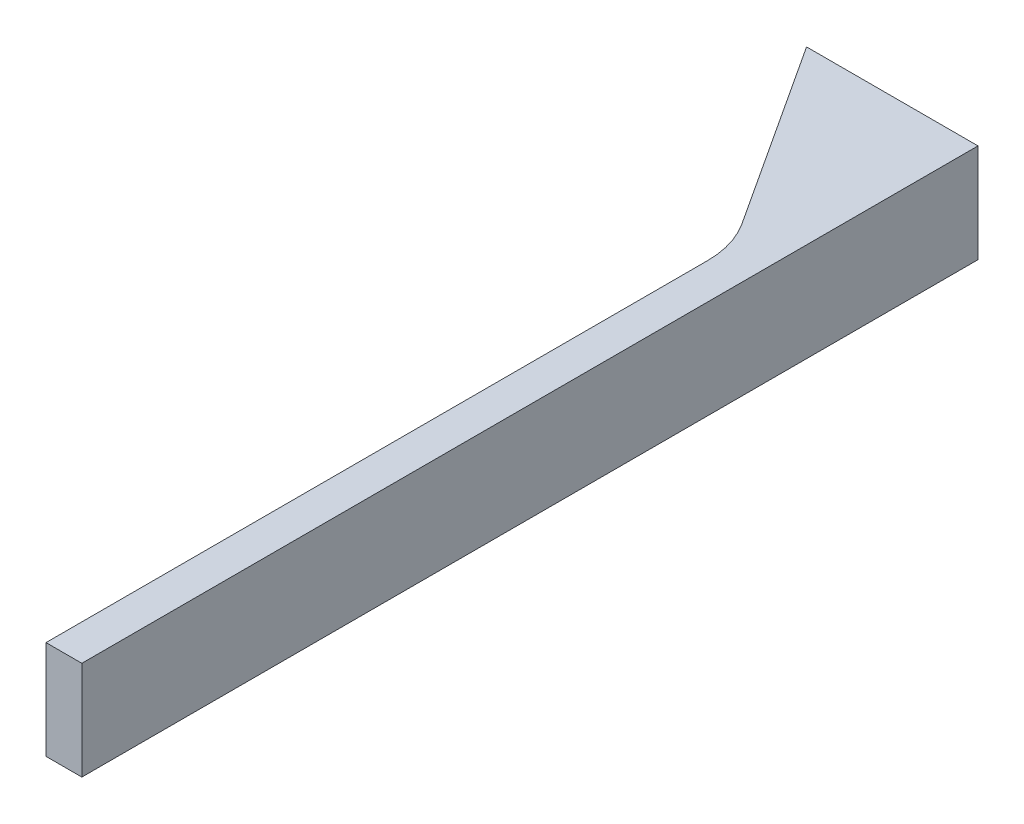
ISO-10303-21;
HEADER;
FILE_DESCRIPTION(('STEP AP214'),'2;1');
FILE_NAME('part.step','',(''),(''),'','','');
FILE_SCHEMA(('AUTOMOTIVE_DESIGN { 1 0 10303 214 1 1 1 1 }'));
ENDSEC;
DATA;
#1=APPLICATION_CONTEXT('core data for automotive mechanical design processes');
#2=APPLICATION_PROTOCOL_DEFINITION('international standard','automotive_design',2000,#1);
#3=PRODUCT_CONTEXT('',#1,'mechanical');
#4=PRODUCT('Part','Part','',(#3));
#5=PRODUCT_RELATED_PRODUCT_CATEGORY('part','',(#4));
#6=PRODUCT_DEFINITION_FORMATION('','',#4);
#7=PRODUCT_DEFINITION_CONTEXT('part definition',#1,'design');
#8=PRODUCT_DEFINITION('design','',#6,#7);
#9=PRODUCT_DEFINITION_SHAPE('','',#8);
#10=(LENGTH_UNIT() NAMED_UNIT(*) SI_UNIT(.MILLI.,.METRE.));
#11=(NAMED_UNIT(*) PLANE_ANGLE_UNIT() SI_UNIT($,.RADIAN.));
#12=(NAMED_UNIT(*) SI_UNIT($,.STERADIAN.) SOLID_ANGLE_UNIT());
#13=UNCERTAINTY_MEASURE_WITH_UNIT(LENGTH_MEASURE(1.E-05),#10,'distance_accuracy_value','');
#14=(GEOMETRIC_REPRESENTATION_CONTEXT(3) GLOBAL_UNCERTAINTY_ASSIGNED_CONTEXT((#13)) GLOBAL_UNIT_ASSIGNED_CONTEXT((#10,
#11,#12)) REPRESENTATION_CONTEXT('',''));
#15=CARTESIAN_POINT('',(0.,0.,0.));
#16=DIRECTION('',(0.,0.,1.));
#17=DIRECTION('',(1.,0.,0.));
#18=AXIS2_PLACEMENT_3D('',#15,#16,#17);
#19=CARTESIAN_POINT('',(-15.,-5.5,-100.));
#20=DIRECTION('',(-1.,0.,0.));
#21=DIRECTION('',(0.,0.,1.));
#22=AXIS2_PLACEMENT_3D('',#19,#20,#21);
#23=PLANE('',#22);
#24=DIRECTION('',(0.,0.,1.));
#25=VECTOR('',#24,1.);
#26=CARTESIAN_POINT('',(-15.,5.5,-100.));
#27=LINE('',#26,#25);
#28=CARTESIAN_POINT('',(-15.,5.5,-73.8116063262557));
#29=VERTEX_POINT('',#28);
#30=CARTESIAN_POINT('',(-15.,5.5,0.));
#31=VERTEX_POINT('',#30);
#32=EDGE_CURVE('E151',#29,#31,#27,.T.);
#33=ORIENTED_EDGE('',*,*,#32,.F.);
#34=DIRECTION('',(0.,-1.,0.));
#35=VECTOR('',#34,1.);
#36=CARTESIAN_POINT('',(-15.,-5.5,-73.8116063262557));
#37=LINE('',#36,#35);
#38=CARTESIAN_POINT('',(-15.,-5.5,-73.8116063262557));
#39=VERTEX_POINT('',#38);
#40=EDGE_CURVE('E147',#29,#39,#37,.T.);
#41=ORIENTED_EDGE('',*,*,#40,.T.);
#42=DIRECTION('',(0.,0.,1.));
#43=VECTOR('',#42,1.);
#44=CARTESIAN_POINT('',(-15.,-5.5,-100.));
#45=LINE('',#44,#43);
#46=CARTESIAN_POINT('',(-15.,-5.5,0.));
#47=VERTEX_POINT('',#46);
#48=EDGE_CURVE('E148',#39,#47,#45,.T.);
#49=ORIENTED_EDGE('',*,*,#48,.T.);
#50=DIRECTION('',(0.,-1.,0.));
#51=VECTOR('',#50,1.);
#52=CARTESIAN_POINT('',(-15.,-5.5,0.));
#53=LINE('',#52,#51);
#54=EDGE_CURVE('E137',#31,#47,#53,.T.);
#55=ORIENTED_EDGE('',*,*,#54,.F.);
#56=EDGE_LOOP('',(#33,#41,#49,#55));
#57=FACE_BOUND('',#56,.T.);
#58=ADVANCED_FACE('F45',(#57),#23,.T.);
#59=CARTESIAN_POINT('',(-11.,5.5,-100.));
#60=DIRECTION('',(1.,0.,0.));
#61=DIRECTION('',(0.,0.,-1.));
#62=AXIS2_PLACEMENT_3D('',#59,#60,#61);
#63=PLANE('',#62);
#64=DIRECTION('',(0.,1.,0.));
#65=VECTOR('',#64,1.);
#66=CARTESIAN_POINT('',(-11.,5.5,0.));
#67=LINE('',#66,#65);
#68=CARTESIAN_POINT('',(-11.,-5.5,0.));
#69=VERTEX_POINT('',#68);
#70=CARTESIAN_POINT('',(-11.,5.5,0.));
#71=VERTEX_POINT('',#70);
#72=EDGE_CURVE('E121',#69,#71,#67,.T.);
#73=ORIENTED_EDGE('',*,*,#72,.F.);
#74=DIRECTION('',(0.,0.,1.));
#75=VECTOR('',#74,1.);
#76=CARTESIAN_POINT('',(-11.,-5.5,-100.));
#77=LINE('',#76,#75);
#78=CARTESIAN_POINT('',(-11.,-5.5,-100.));
#79=VERTEX_POINT('',#78);
#80=EDGE_CURVE('E144',#79,#69,#77,.T.);
#81=ORIENTED_EDGE('',*,*,#80,.F.);
#82=DIRECTION('',(0.,1.,0.));
#83=VECTOR('',#82,1.);
#84=CARTESIAN_POINT('',(-11.,5.5,-100.));
#85=LINE('',#84,#83);
#86=CARTESIAN_POINT('',(-11.,5.5,-100.));
#87=VERTEX_POINT('',#86);
#88=EDGE_CURVE('E115',#79,#87,#85,.T.);
#89=ORIENTED_EDGE('',*,*,#88,.T.);
#90=DIRECTION('',(0.,0.,1.));
#91=VECTOR('',#90,1.);
#92=CARTESIAN_POINT('',(-11.,5.5,-100.));
#93=LINE('',#92,#91);
#94=EDGE_CURVE('E109',#87,#71,#93,.T.);
#95=ORIENTED_EDGE('',*,*,#94,.T.);
#96=EDGE_LOOP('',(#73,#81,#89,#95));
#97=FACE_BOUND('',#96,.T.);
#98=ADVANCED_FACE('F177',(#97),#63,.T.);
#99=CARTESIAN_POINT('',(-11.,-5.5,-100.));
#100=DIRECTION('',(0.,-1.,0.));
#101=DIRECTION('',(0.,0.,-1.));
#102=AXIS2_PLACEMENT_3D('',#99,#100,#101);
#103=PLANE('',#102);
#104=DIRECTION('',(1.,0.,0.));
#105=VECTOR('',#104,1.);
#106=CARTESIAN_POINT('',(-11.,-5.5,0.));
#107=LINE('',#106,#105);
#108=EDGE_CURVE('E130',#47,#69,#107,.T.);
#109=ORIENTED_EDGE('',*,*,#108,.F.);
#110=ORIENTED_EDGE('',*,*,#48,.F.);
#111=CARTESIAN_POINT('',(-25.,-5.5,-73.8116063262557));
#112=DIRECTION('',(0.,-1.,0.));
#113=DIRECTION('',(0.,0.,-1.));
#114=AXIS2_PLACEMENT_3D('',#111,#112,#113);
#115=CIRCLE('',#114,10.);
#116=CARTESIAN_POINT('',(-16.6221021922619,-5.5,-79.2715356594153));
#117=VERTEX_POINT('',#116);
#118=EDGE_CURVE('E54',#39,#117,#115,.F.);
#119=ORIENTED_EDGE('',*,*,#118,.T.);
#120=DIRECTION('',(-0.545992933315959,0.,-0.837789780773814));
#121=VECTOR('',#120,1.);
#122=CARTESIAN_POINT('',(-30.1309743558704,-5.5,-100.));
#123=LINE('',#122,#121);
#124=CARTESIAN_POINT('',(-30.1309743558704,-5.5,-100.));
#125=VERTEX_POINT('',#124);
#126=EDGE_CURVE('E103',#117,#125,#123,.T.);
#127=ORIENTED_EDGE('',*,*,#126,.T.);
#128=DIRECTION('',(1.,0.,0.));
#129=VECTOR('',#128,1.);
#130=CARTESIAN_POINT('',(-11.,-5.5,-100.));
#131=LINE('',#130,#129);
#132=EDGE_CURVE('E114',#125,#79,#131,.T.);
#133=ORIENTED_EDGE('',*,*,#132,.T.);
#134=ORIENTED_EDGE('',*,*,#80,.T.);
#135=EDGE_LOOP('',(#109,#110,#119,#127,#133,#134));
#136=FACE_BOUND('',#135,.T.);
#137=ADVANCED_FACE('F167',(#136),#103,.T.);
#138=CARTESIAN_POINT('',(-15.,5.5,-100.));
#139=DIRECTION('',(0.,1.,0.));
#140=DIRECTION('',(0.,0.,1.));
#141=AXIS2_PLACEMENT_3D('',#138,#139,#140);
#142=PLANE('',#141);
#143=DIRECTION('',(-1.,0.,0.));
#144=VECTOR('',#143,1.);
#145=CARTESIAN_POINT('',(-15.,5.5,0.));
#146=LINE('',#145,#144);
#147=EDGE_CURVE('E125',#71,#31,#146,.T.);
#148=ORIENTED_EDGE('',*,*,#147,.F.);
#149=ORIENTED_EDGE('',*,*,#94,.F.);
#150=DIRECTION('',(-1.,0.,0.));
#151=VECTOR('',#150,1.);
#152=CARTESIAN_POINT('',(-15.,5.5,-100.));
#153=LINE('',#152,#151);
#154=CARTESIAN_POINT('',(-30.1309743558704,5.5,-100.));
#155=VERTEX_POINT('',#154);
#156=EDGE_CURVE('E106',#87,#155,#153,.T.);
#157=ORIENTED_EDGE('',*,*,#156,.T.);
#158=DIRECTION('',(-0.545992933315959,0.,-0.837789780773814));
#159=VECTOR('',#158,1.);
#160=CARTESIAN_POINT('',(-30.1309743558704,5.5,-100.));
#161=LINE('',#160,#159);
#162=CARTESIAN_POINT('',(-16.6221021922619,5.5,-79.2715356594153));
#163=VERTEX_POINT('',#162);
#164=EDGE_CURVE('E95',#163,#155,#161,.T.);
#165=ORIENTED_EDGE('',*,*,#164,.F.);
#166=CARTESIAN_POINT('',(-25.,5.5,-73.8116063262557));
#167=DIRECTION('',(0.,1.,0.));
#168=DIRECTION('',(0.,0.,1.));
#169=AXIS2_PLACEMENT_3D('',#166,#167,#168);
#170=CIRCLE('',#169,10.);
#171=EDGE_CURVE('E11',#163,#29,#170,.F.);
#172=ORIENTED_EDGE('',*,*,#171,.T.);
#173=ORIENTED_EDGE('',*,*,#32,.T.);
#174=EDGE_LOOP('',(#148,#149,#157,#165,#172,#173));
#175=FACE_BOUND('',#174,.T.);
#176=ADVANCED_FACE('F108',(#175),#142,.T.);
#177=CARTESIAN_POINT('',(0.,0.,-100.));
#178=DIRECTION('',(0.,0.,-1.));
#179=DIRECTION('',(-1.,0.,0.));
#180=AXIS2_PLACEMENT_3D('',#177,#178,#179);
#181=PLANE('',#180);
#182=ORIENTED_EDGE('',*,*,#88,.F.);
#183=ORIENTED_EDGE('',*,*,#132,.F.);
#184=DIRECTION('',(0.,-1.,0.));
#185=VECTOR('',#184,1.);
#186=CARTESIAN_POINT('',(-30.1309743558704,33.2127659216687,-100.));
#187=LINE('',#186,#185);
#188=EDGE_CURVE('E99',#155,#125,#187,.T.);
#189=ORIENTED_EDGE('',*,*,#188,.F.);
#190=ORIENTED_EDGE('',*,*,#156,.F.);
#191=EDGE_LOOP('',(#182,#183,#189,#190));
#192=FACE_BOUND('',#191,.T.);
#193=ADVANCED_FACE('F118',(#192),#181,.T.);
#194=CARTESIAN_POINT('',(0.,0.,0.));
#195=DIRECTION('',(0.,0.,-1.));
#196=DIRECTION('',(-1.,0.,0.));
#197=AXIS2_PLACEMENT_3D('',#194,#195,#196);
#198=PLANE('',#197);
#199=ORIENTED_EDGE('',*,*,#72,.T.);
#200=ORIENTED_EDGE('',*,*,#147,.T.);
#201=ORIENTED_EDGE('',*,*,#54,.T.);
#202=ORIENTED_EDGE('',*,*,#108,.T.);
#203=EDGE_LOOP('',(#199,#200,#201,#202));
#204=FACE_BOUND('',#203,.T.);
#205=ADVANCED_FACE('F170',(#204),#198,.F.);
#206=CARTESIAN_POINT('',(-30.1309743558704,33.2127659216687,-100.));
#207=DIRECTION('',(-0.837789780773814,0.,0.545992933315959));
#208=DIRECTION('',(0.545992933315959,0.,0.837789780773814));
#209=AXIS2_PLACEMENT_3D('',#206,#207,#208);
#210=PLANE('',#209);
#211=ORIENTED_EDGE('',*,*,#126,.F.);
#212=DIRECTION('',(0.,-1.,0.));
#213=VECTOR('',#212,1.);
#214=CARTESIAN_POINT('',(-16.6221021922619,5.5,-79.2715356594153));
#215=LINE('',#214,#213);
#216=EDGE_CURVE('E67',#117,#163,#215,.F.);
#217=ORIENTED_EDGE('',*,*,#216,.T.);
#218=ORIENTED_EDGE('',*,*,#164,.T.);
#219=ORIENTED_EDGE('',*,*,#188,.T.);
#220=EDGE_LOOP('',(#211,#217,#218,#219));
#221=FACE_BOUND('',#220,.T.);
#222=ADVANCED_FACE('F97',(#221),#210,.T.);
#223=CARTESIAN_POINT('',(-25.,-5.5,-73.8116063262557));
#224=DIRECTION('',(0.,1.,0.));
#225=DIRECTION('',(0.,0.,1.));
#226=AXIS2_PLACEMENT_3D('',#223,#224,#225);
#227=CYLINDRICAL_SURFACE('',#226,10.);
#228=ORIENTED_EDGE('',*,*,#171,.F.);
#229=ORIENTED_EDGE('',*,*,#216,.F.);
#230=ORIENTED_EDGE('',*,*,#118,.F.);
#231=ORIENTED_EDGE('',*,*,#40,.F.);
#232=EDGE_LOOP('',(#228,#229,#230,#231));
#233=FACE_BOUND('',#232,.T.);
#234=ADVANCED_FACE('F47',(#233),#227,.F.);
#235=CLOSED_SHELL('',(#58,#98,#137,#176,#193,#205,#222,#234));
#236=MANIFOLD_SOLID_BREP('B2',#235);
#237=ADVANCED_BREP_SHAPE_REPRESENTATION('',(#18,#236),#14);
#238=SHAPE_DEFINITION_REPRESENTATION(#9,#237);
ENDSEC;
END-ISO-10303-21;
